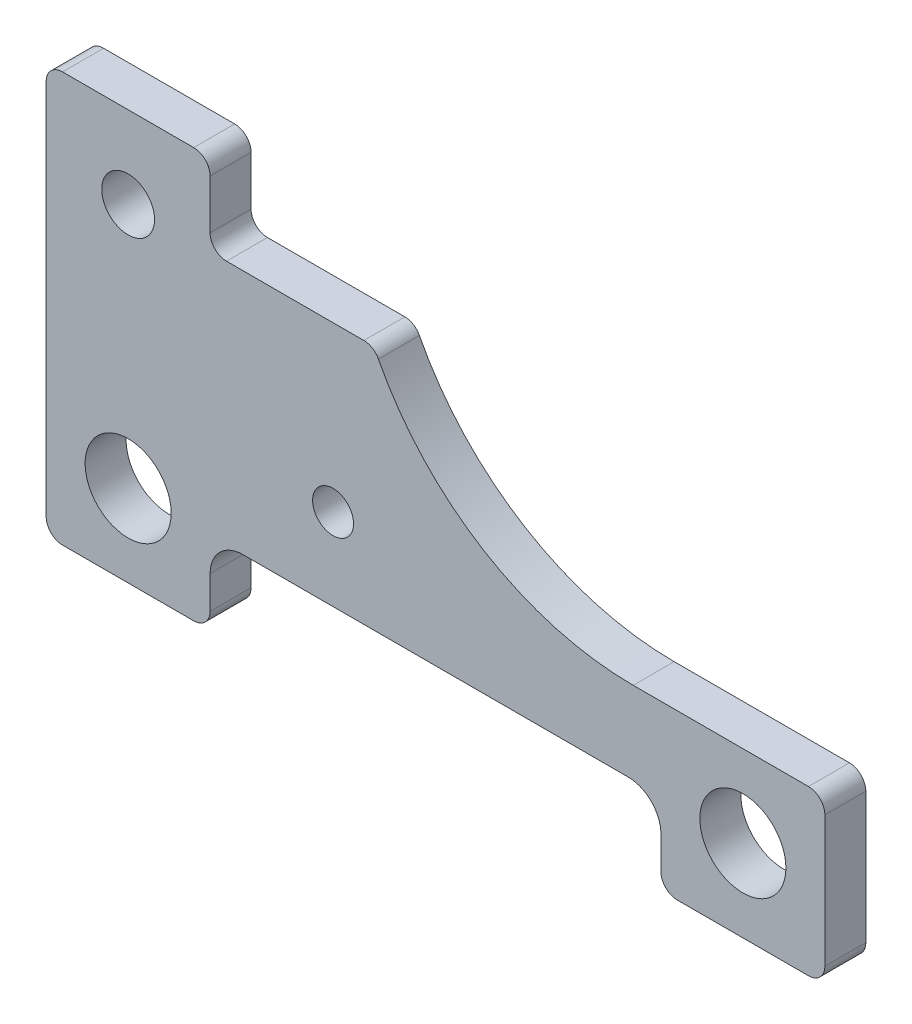
ISO-10303-21;
HEADER;
FILE_DESCRIPTION(('STEP AP214'),'2;1');
FILE_NAME('part.step','',(''),(''),'','','');
FILE_SCHEMA(('AUTOMOTIVE_DESIGN { 1 0 10303 214 1 1 1 1 }'));
ENDSEC;
DATA;
#1=APPLICATION_CONTEXT('core data for automotive mechanical design processes');
#2=APPLICATION_PROTOCOL_DEFINITION('international standard','automotive_design',2000,#1);
#3=PRODUCT_CONTEXT('',#1,'mechanical');
#4=PRODUCT('Part','Part','',(#3));
#5=PRODUCT_RELATED_PRODUCT_CATEGORY('part','',(#4));
#6=PRODUCT_DEFINITION_FORMATION('','',#4);
#7=PRODUCT_DEFINITION_CONTEXT('part definition',#1,'design');
#8=PRODUCT_DEFINITION('design','',#6,#7);
#9=PRODUCT_DEFINITION_SHAPE('','',#8);
#10=(LENGTH_UNIT() NAMED_UNIT(*) SI_UNIT(.MILLI.,.METRE.));
#11=(NAMED_UNIT(*) PLANE_ANGLE_UNIT() SI_UNIT($,.RADIAN.));
#12=(NAMED_UNIT(*) SI_UNIT($,.STERADIAN.) SOLID_ANGLE_UNIT());
#13=UNCERTAINTY_MEASURE_WITH_UNIT(LENGTH_MEASURE(1.E-05),#10,'distance_accuracy_value','');
#14=(GEOMETRIC_REPRESENTATION_CONTEXT(3) GLOBAL_UNCERTAINTY_ASSIGNED_CONTEXT((#13)) GLOBAL_UNIT_ASSIGNED_CONTEXT((#10,
#11,#12)) REPRESENTATION_CONTEXT('',''));
#15=CARTESIAN_POINT('',(0.,0.,0.));
#16=DIRECTION('',(0.,0.,1.));
#17=DIRECTION('',(1.,0.,0.));
#18=AXIS2_PLACEMENT_3D('',#15,#16,#17);
#19=CARTESIAN_POINT('',(24.1237229910367,54.9980046734949,2.5));
#20=DIRECTION('',(0.,0.,1.));
#21=DIRECTION('',(1.,0.,0.));
#22=AXIS2_PLACEMENT_3D('',#19,#20,#21);
#23=PLANE('',#22);
#24=CARTESIAN_POINT('',(37.5,9.9980046734949,2.5));
#25=DIRECTION('',(0.,0.,1.));
#26=DIRECTION('',(1.,0.,0.));
#27=AXIS2_PLACEMENT_3D('',#24,#25,#26);
#28=CIRCLE('',#27,5.25);
#29=CARTESIAN_POINT('',(42.75,9.9980046734949,2.5));
#30=VERTEX_POINT('',#29);
#31=EDGE_CURVE('E786',#30,#30,#28,.T.);
#32=ORIENTED_EDGE('',*,*,#31,.F.);
#33=EDGE_LOOP('',(#32));
#34=FACE_BOUND('',#33,.T.);
#35=CARTESIAN_POINT('',(-37.5,40.,2.5));
#36=DIRECTION('',(0.,0.,1.));
#37=DIRECTION('',(1.,0.,0.));
#38=AXIS2_PLACEMENT_3D('',#35,#36,#37);
#39=CIRCLE('',#38,3.225);
#40=CARTESIAN_POINT('',(-34.275,40.,2.5));
#41=VERTEX_POINT('',#40);
#42=EDGE_CURVE('E247',#41,#41,#39,.T.);
#43=ORIENTED_EDGE('',*,*,#42,.F.);
#44=EDGE_LOOP('',(#43));
#45=FACE_BOUND('',#44,.T.);
#46=CARTESIAN_POINT('',(24.1237229910367,54.9980046734949,2.5));
#47=DIRECTION('',(0.,0.,-1.));
#48=DIRECTION('',(1.,0.,0.));
#49=AXIS2_PLACEMENT_3D('',#46,#47,#48);
#50=CIRCLE('',#49,35.);
#51=CARTESIAN_POINT('',(24.1237229910367,19.9980046734949,2.5));
#52=VERTEX_POINT('',#51);
#53=CARTESIAN_POINT('',(-6.96420927938158,38.9188110634321,2.5));
#54=VERTEX_POINT('',#53);
#55=EDGE_CURVE('E199',#52,#54,#50,.T.);
#56=ORIENTED_EDGE('',*,*,#55,.T.);
#57=CARTESIAN_POINT('',(-8.74066255197692,38.,2.5));
#58=DIRECTION('',(0.,0.,1.));
#59=DIRECTION('',(1.,0.,0.));
#60=AXIS2_PLACEMENT_3D('',#57,#58,#59);
#61=CIRCLE('',#60,2.);
#62=CARTESIAN_POINT('',(-8.74066255197692,40.,2.5));
#63=VERTEX_POINT('',#62);
#64=EDGE_CURVE('E366',#54,#63,#61,.T.);
#65=ORIENTED_EDGE('',*,*,#64,.T.);
#66=DIRECTION('',(-1.,0.,0.));
#67=VECTOR('',#66,1.);
#68=CARTESIAN_POINT('',(-27.5,40.,2.5));
#69=LINE('',#68,#67);
#70=CARTESIAN_POINT('',(-25.5,40.,2.5));
#71=VERTEX_POINT('',#70);
#72=EDGE_CURVE('E226',#63,#71,#69,.T.);
#73=ORIENTED_EDGE('',*,*,#72,.T.);
#74=CARTESIAN_POINT('',(-25.5,42.,2.5));
#75=DIRECTION('',(0.,0.,1.));
#76=DIRECTION('',(1.,0.,0.));
#77=AXIS2_PLACEMENT_3D('',#74,#75,#76);
#78=CIRCLE('',#77,2.);
#79=CARTESIAN_POINT('',(-27.5,42.,2.5));
#80=VERTEX_POINT('',#79);
#81=EDGE_CURVE('E11',#71,#80,#78,.F.);
#82=ORIENTED_EDGE('',*,*,#81,.T.);
#83=DIRECTION('',(0.,1.,0.));
#84=VECTOR('',#83,1.);
#85=CARTESIAN_POINT('',(-27.5,50.,2.5));
#86=LINE('',#85,#84);
#87=CARTESIAN_POINT('',(-27.5,48.,2.5));
#88=VERTEX_POINT('',#87);
#89=EDGE_CURVE('E230',#80,#88,#86,.T.);
#90=ORIENTED_EDGE('',*,*,#89,.T.);
#91=CARTESIAN_POINT('',(-29.5,48.,2.5));
#92=DIRECTION('',(0.,0.,1.));
#93=DIRECTION('',(1.,0.,0.));
#94=AXIS2_PLACEMENT_3D('',#91,#92,#93);
#95=CIRCLE('',#94,2.);
#96=CARTESIAN_POINT('',(-29.5,50.,2.5));
#97=VERTEX_POINT('',#96);
#98=EDGE_CURVE('E355',#88,#97,#95,.T.);
#99=ORIENTED_EDGE('',*,*,#98,.T.);
#100=DIRECTION('',(-1.,0.,0.));
#101=VECTOR('',#100,1.);
#102=CARTESIAN_POINT('',(-47.5,50.,2.5));
#103=LINE('',#102,#101);
#104=CARTESIAN_POINT('',(-45.5,50.,2.5));
#105=VERTEX_POINT('',#104);
#106=EDGE_CURVE('E237',#97,#105,#103,.T.);
#107=ORIENTED_EDGE('',*,*,#106,.T.);
#108=CARTESIAN_POINT('',(-45.5,48.,2.5));
#109=DIRECTION('',(0.,0.,1.));
#110=DIRECTION('',(1.,0.,0.));
#111=AXIS2_PLACEMENT_3D('',#108,#109,#110);
#112=CIRCLE('',#111,2.);
#113=CARTESIAN_POINT('',(-47.5,48.,2.5));
#114=VERTEX_POINT('',#113);
#115=EDGE_CURVE('E62',#105,#114,#112,.T.);
#116=ORIENTED_EDGE('',*,*,#115,.T.);
#117=DIRECTION('',(0.,-1.,0.));
#118=VECTOR('',#117,1.);
#119=CARTESIAN_POINT('',(-47.5,0.,2.5));
#120=LINE('',#119,#118);
#121=CARTESIAN_POINT('',(-47.5,1.99999999999999,2.5));
#122=VERTEX_POINT('',#121);
#123=EDGE_CURVE('E220',#114,#122,#120,.T.);
#124=ORIENTED_EDGE('',*,*,#123,.T.);
#125=CARTESIAN_POINT('',(-45.5,1.99999999999999,2.5));
#126=DIRECTION('',(0.,0.,1.));
#127=DIRECTION('',(1.,0.,0.));
#128=AXIS2_PLACEMENT_3D('',#125,#126,#127);
#129=CIRCLE('',#128,2.);
#130=CARTESIAN_POINT('',(-45.5,0.,2.5));
#131=VERTEX_POINT('',#130);
#132=EDGE_CURVE('E347',#122,#131,#129,.T.);
#133=ORIENTED_EDGE('',*,*,#132,.T.);
#134=DIRECTION('',(1.,0.,0.));
#135=VECTOR('',#134,1.);
#136=CARTESIAN_POINT('',(-47.5,0.,2.5));
#137=LINE('',#136,#135);
#138=CARTESIAN_POINT('',(-29.5,0.,2.5));
#139=VERTEX_POINT('',#138);
#140=EDGE_CURVE('E285',#131,#139,#137,.T.);
#141=ORIENTED_EDGE('',*,*,#140,.T.);
#142=CARTESIAN_POINT('',(-29.5,2.,2.5));
#143=DIRECTION('',(0.,0.,1.));
#144=DIRECTION('',(1.,0.,0.));
#145=AXIS2_PLACEMENT_3D('',#142,#143,#144);
#146=CIRCLE('',#145,2.);
#147=CARTESIAN_POINT('',(-27.5,2.,2.5));
#148=VERTEX_POINT('',#147);
#149=EDGE_CURVE('E350',#139,#148,#146,.T.);
#150=ORIENTED_EDGE('',*,*,#149,.T.);
#151=DIRECTION('',(0.,1.,0.));
#152=VECTOR('',#151,1.);
#153=CARTESIAN_POINT('',(-27.5,0.,2.5));
#154=LINE('',#153,#152);
#155=CARTESIAN_POINT('',(-27.5,6.,2.5));
#156=VERTEX_POINT('',#155);
#157=EDGE_CURVE('E463',#148,#156,#154,.T.);
#158=ORIENTED_EDGE('',*,*,#157,.T.);
#159=CARTESIAN_POINT('',(-23.5,6.,2.5));
#160=DIRECTION('',(0.,0.,1.));
#161=DIRECTION('',(1.,0.,0.));
#162=AXIS2_PLACEMENT_3D('',#159,#160,#161);
#163=CIRCLE('',#162,4.);
#164=CARTESIAN_POINT('',(-23.5,10.,2.5));
#165=VERTEX_POINT('',#164);
#166=EDGE_CURVE('E311',#156,#165,#163,.F.);
#167=ORIENTED_EDGE('',*,*,#166,.T.);
#168=DIRECTION('',(1.,0.,0.));
#169=VECTOR('',#168,1.);
#170=CARTESIAN_POINT('',(-27.5,10.,2.5));
#171=LINE('',#170,#169);
#172=CARTESIAN_POINT('',(23.5,10.,2.5));
#173=VERTEX_POINT('',#172);
#174=EDGE_CURVE('E466',#165,#173,#171,.T.);
#175=ORIENTED_EDGE('',*,*,#174,.T.);
#176=CARTESIAN_POINT('',(23.5,6.,2.5));
#177=DIRECTION('',(0.,0.,1.));
#178=DIRECTION('',(1.,0.,0.));
#179=AXIS2_PLACEMENT_3D('',#176,#177,#178);
#180=CIRCLE('',#179,4.);
#181=CARTESIAN_POINT('',(27.5,6.,2.5));
#182=VERTEX_POINT('',#181);
#183=EDGE_CURVE('E304',#173,#182,#180,.F.);
#184=ORIENTED_EDGE('',*,*,#183,.T.);
#185=DIRECTION('',(0.,-1.,0.));
#186=VECTOR('',#185,1.);
#187=CARTESIAN_POINT('',(27.5,10.,2.5));
#188=LINE('',#187,#186);
#189=CARTESIAN_POINT('',(27.5,1.9980046734949,2.5));
#190=VERTEX_POINT('',#189);
#191=EDGE_CURVE('E475',#182,#190,#188,.T.);
#192=ORIENTED_EDGE('',*,*,#191,.T.);
#193=CARTESIAN_POINT('',(29.5,1.9980046734949,2.5));
#194=DIRECTION('',(0.,0.,1.));
#195=DIRECTION('',(1.,0.,0.));
#196=AXIS2_PLACEMENT_3D('',#193,#194,#195);
#197=CIRCLE('',#196,2.);
#198=CARTESIAN_POINT('',(29.5,-0.0019953265051019,2.5));
#199=VERTEX_POINT('',#198);
#200=EDGE_CURVE('E363',#190,#199,#197,.T.);
#201=ORIENTED_EDGE('',*,*,#200,.T.);
#202=DIRECTION('',(1.,0.,0.));
#203=VECTOR('',#202,1.);
#204=CARTESIAN_POINT('',(27.5,-0.0019953265051019,2.5));
#205=LINE('',#204,#203);
#206=CARTESIAN_POINT('',(45.5,-0.0019953265051019,2.5));
#207=VERTEX_POINT('',#206);
#208=EDGE_CURVE('E479',#199,#207,#205,.T.);
#209=ORIENTED_EDGE('',*,*,#208,.T.);
#210=CARTESIAN_POINT('',(45.5,1.9980046734949,2.5));
#211=DIRECTION('',(0.,0.,1.));
#212=DIRECTION('',(1.,0.,0.));
#213=AXIS2_PLACEMENT_3D('',#210,#211,#212);
#214=CIRCLE('',#213,2.);
#215=CARTESIAN_POINT('',(47.5,1.9980046734949,2.5));
#216=VERTEX_POINT('',#215);
#217=EDGE_CURVE('E360',#207,#216,#214,.T.);
#218=ORIENTED_EDGE('',*,*,#217,.T.);
#219=DIRECTION('',(0.,1.,0.));
#220=VECTOR('',#219,1.);
#221=CARTESIAN_POINT('',(47.5,-0.0019953265051019,2.5));
#222=LINE('',#221,#220);
#223=CARTESIAN_POINT('',(47.5,17.9980046734949,2.5));
#224=VERTEX_POINT('',#223);
#225=EDGE_CURVE('E208',#216,#224,#222,.T.);
#226=ORIENTED_EDGE('',*,*,#225,.T.);
#227=CARTESIAN_POINT('',(45.5,17.9980046734949,2.5));
#228=DIRECTION('',(0.,0.,1.));
#229=DIRECTION('',(1.,0.,0.));
#230=AXIS2_PLACEMENT_3D('',#227,#228,#229);
#231=CIRCLE('',#230,2.);
#232=CARTESIAN_POINT('',(45.5,19.9980046734949,2.5));
#233=VERTEX_POINT('',#232);
#234=EDGE_CURVE('E203',#224,#233,#231,.T.);
#235=ORIENTED_EDGE('',*,*,#234,.T.);
#236=DIRECTION('',(-1.,0.,0.));
#237=VECTOR('',#236,1.);
#238=CARTESIAN_POINT('',(47.5,19.9980046734949,2.5));
#239=LINE('',#238,#237);
#240=EDGE_CURVE('E195',#233,#52,#239,.T.);
#241=ORIENTED_EDGE('',*,*,#240,.T.);
#242=EDGE_LOOP('',(#56,#65,#73,#82,#90,#99,#107,#116,#124,#133,#141,#150,#158,#167,#175,#184,
#192,#201,#209,#218,#226,#235,#241));
#243=FACE_BOUND('',#242,.T.);
#244=CARTESIAN_POINT('',(-37.5,10.,2.5));
#245=DIRECTION('',(0.,0.,1.));
#246=DIRECTION('',(1.,0.,0.));
#247=AXIS2_PLACEMENT_3D('',#244,#245,#246);
#248=CIRCLE('',#247,5.25);
#249=CARTESIAN_POINT('',(-32.25,10.,2.5));
#250=VERTEX_POINT('',#249);
#251=EDGE_CURVE('E777',#250,#250,#248,.T.);
#252=ORIENTED_EDGE('',*,*,#251,.F.);
#253=EDGE_LOOP('',(#252));
#254=FACE_BOUND('',#253,.T.);
#255=CARTESIAN_POINT('',(-12.5,20.,2.5));
#256=DIRECTION('',(0.,0.,1.));
#257=DIRECTION('',(1.,0.,0.));
#258=AXIS2_PLACEMENT_3D('',#255,#256,#257);
#259=CIRCLE('',#258,2.5);
#260=CARTESIAN_POINT('',(-10.,20.,2.5));
#261=VERTEX_POINT('',#260);
#262=EDGE_CURVE('E793',#261,#261,#259,.T.);
#263=ORIENTED_EDGE('',*,*,#262,.F.);
#264=EDGE_LOOP('',(#263));
#265=FACE_BOUND('',#264,.T.);
#266=ADVANCED_FACE('F39',(#34,#45,#243,#254,#265),#23,.T.);
#267=CARTESIAN_POINT('',(24.1237229910367,54.9980046734949,-2.5));
#268=DIRECTION('',(0.,0.,1.));
#269=DIRECTION('',(1.,0.,0.));
#270=AXIS2_PLACEMENT_3D('',#267,#268,#269);
#271=PLANE('',#270);
#272=DIRECTION('',(-1.,0.,0.));
#273=VECTOR('',#272,1.);
#274=CARTESIAN_POINT('',(-27.5,40.,-2.5));
#275=LINE('',#274,#273);
#276=CARTESIAN_POINT('',(-8.74066255197692,40.,-2.5));
#277=VERTEX_POINT('',#276);
#278=CARTESIAN_POINT('',(-25.5,40.,-2.5));
#279=VERTEX_POINT('',#278);
#280=EDGE_CURVE('E271',#277,#279,#275,.T.);
#281=ORIENTED_EDGE('',*,*,#280,.F.);
#282=CARTESIAN_POINT('',(-8.74066255197692,38.,-2.5));
#283=DIRECTION('',(0.,0.,1.));
#284=DIRECTION('',(1.,0.,0.));
#285=AXIS2_PLACEMENT_3D('',#282,#283,#284);
#286=CIRCLE('',#285,2.);
#287=CARTESIAN_POINT('',(-6.96420927938158,38.9188110634321,-2.5));
#288=VERTEX_POINT('',#287);
#289=EDGE_CURVE('E342',#277,#288,#286,.F.);
#290=ORIENTED_EDGE('',*,*,#289,.T.);
#291=CARTESIAN_POINT('',(24.1237229910367,54.9980046734949,-2.5));
#292=DIRECTION('',(0.,0.,-1.));
#293=DIRECTION('',(1.,0.,0.));
#294=AXIS2_PLACEMENT_3D('',#291,#292,#293);
#295=CIRCLE('',#294,35.);
#296=CARTESIAN_POINT('',(24.1237229910367,19.9980046734949,-2.5));
#297=VERTEX_POINT('',#296);
#298=EDGE_CURVE('E268',#297,#288,#295,.T.);
#299=ORIENTED_EDGE('',*,*,#298,.F.);
#300=DIRECTION('',(-1.,0.,0.));
#301=VECTOR('',#300,1.);
#302=CARTESIAN_POINT('',(47.5,19.9980046734949,-2.5));
#303=LINE('',#302,#301);
#304=CARTESIAN_POINT('',(45.5,19.9980046734949,-2.5));
#305=VERTEX_POINT('',#304);
#306=EDGE_CURVE('E214',#305,#297,#303,.T.);
#307=ORIENTED_EDGE('',*,*,#306,.F.);
#308=CARTESIAN_POINT('',(45.5,17.9980046734949,-2.5));
#309=DIRECTION('',(0.,0.,1.));
#310=DIRECTION('',(1.,0.,0.));
#311=AXIS2_PLACEMENT_3D('',#308,#309,#310);
#312=CIRCLE('',#311,2.);
#313=CARTESIAN_POINT('',(47.5,17.9980046734949,-2.5));
#314=VERTEX_POINT('',#313);
#315=EDGE_CURVE('E333',#305,#314,#312,.F.);
#316=ORIENTED_EDGE('',*,*,#315,.T.);
#317=DIRECTION('',(0.,1.,0.));
#318=VECTOR('',#317,1.);
#319=CARTESIAN_POINT('',(47.5,-0.0019953265051019,-2.5));
#320=LINE('',#319,#318);
#321=CARTESIAN_POINT('',(47.5,1.9980046734949,-2.5));
#322=VERTEX_POINT('',#321);
#323=EDGE_CURVE('E262',#322,#314,#320,.T.);
#324=ORIENTED_EDGE('',*,*,#323,.F.);
#325=CARTESIAN_POINT('',(45.5,1.9980046734949,-2.5));
#326=DIRECTION('',(0.,0.,1.));
#327=DIRECTION('',(1.,0.,0.));
#328=AXIS2_PLACEMENT_3D('',#325,#326,#327);
#329=CIRCLE('',#328,2.);
#330=CARTESIAN_POINT('',(45.5,-0.0019953265051019,-2.5));
#331=VERTEX_POINT('',#330);
#332=EDGE_CURVE('E336',#322,#331,#329,.F.);
#333=ORIENTED_EDGE('',*,*,#332,.T.);
#334=DIRECTION('',(1.,0.,0.));
#335=VECTOR('',#334,1.);
#336=CARTESIAN_POINT('',(27.5,-0.0019953265051019,-2.5));
#337=LINE('',#336,#335);
#338=CARTESIAN_POINT('',(29.5,-0.0019953265051019,-2.5));
#339=VERTEX_POINT('',#338);
#340=EDGE_CURVE('E258',#339,#331,#337,.T.);
#341=ORIENTED_EDGE('',*,*,#340,.F.);
#342=CARTESIAN_POINT('',(29.5,1.9980046734949,-2.5));
#343=DIRECTION('',(0.,0.,1.));
#344=DIRECTION('',(1.,0.,0.));
#345=AXIS2_PLACEMENT_3D('',#342,#343,#344);
#346=CIRCLE('',#345,2.);
#347=CARTESIAN_POINT('',(27.5,1.9980046734949,-2.5));
#348=VERTEX_POINT('',#347);
#349=EDGE_CURVE('E339',#339,#348,#346,.F.);
#350=ORIENTED_EDGE('',*,*,#349,.T.);
#351=DIRECTION('',(0.,-1.,0.));
#352=VECTOR('',#351,1.);
#353=CARTESIAN_POINT('',(27.5,10.,-2.5));
#354=LINE('',#353,#352);
#355=CARTESIAN_POINT('',(27.5,6.,-2.5));
#356=VERTEX_POINT('',#355);
#357=EDGE_CURVE('E254',#356,#348,#354,.T.);
#358=ORIENTED_EDGE('',*,*,#357,.F.);
#359=CARTESIAN_POINT('',(23.5,6.,-2.5));
#360=DIRECTION('',(0.,0.,1.));
#361=DIRECTION('',(1.,0.,0.));
#362=AXIS2_PLACEMENT_3D('',#359,#360,#361);
#363=CIRCLE('',#362,4.);
#364=CARTESIAN_POINT('',(23.5,10.,-2.5));
#365=VERTEX_POINT('',#364);
#366=EDGE_CURVE('E301',#356,#365,#363,.T.);
#367=ORIENTED_EDGE('',*,*,#366,.T.);
#368=DIRECTION('',(1.,0.,0.));
#369=VECTOR('',#368,1.);
#370=CARTESIAN_POINT('',(-27.5,10.,-2.5));
#371=LINE('',#370,#369);
#372=CARTESIAN_POINT('',(-23.5,10.,-2.5));
#373=VERTEX_POINT('',#372);
#374=EDGE_CURVE('E250',#373,#365,#371,.T.);
#375=ORIENTED_EDGE('',*,*,#374,.F.);
#376=CARTESIAN_POINT('',(-23.5,6.,-2.5));
#377=DIRECTION('',(0.,0.,1.));
#378=DIRECTION('',(1.,0.,0.));
#379=AXIS2_PLACEMENT_3D('',#376,#377,#378);
#380=CIRCLE('',#379,4.);
#381=CARTESIAN_POINT('',(-27.5,6.,-2.5));
#382=VERTEX_POINT('',#381);
#383=EDGE_CURVE('E307',#373,#382,#380,.T.);
#384=ORIENTED_EDGE('',*,*,#383,.T.);
#385=DIRECTION('',(0.,1.,0.));
#386=VECTOR('',#385,1.);
#387=CARTESIAN_POINT('',(-27.5,0.,-2.5));
#388=LINE('',#387,#386);
#389=CARTESIAN_POINT('',(-27.5,2.,-2.5));
#390=VERTEX_POINT('',#389);
#391=EDGE_CURVE('E246',#390,#382,#388,.T.);
#392=ORIENTED_EDGE('',*,*,#391,.F.);
#393=CARTESIAN_POINT('',(-29.5,2.,-2.5));
#394=DIRECTION('',(0.,0.,1.));
#395=DIRECTION('',(1.,0.,0.));
#396=AXIS2_PLACEMENT_3D('',#393,#394,#395);
#397=CIRCLE('',#396,2.);
#398=CARTESIAN_POINT('',(-29.5,0.,-2.5));
#399=VERTEX_POINT('',#398);
#400=EDGE_CURVE('E324',#390,#399,#397,.F.);
#401=ORIENTED_EDGE('',*,*,#400,.T.);
#402=DIRECTION('',(1.,0.,0.));
#403=VECTOR('',#402,1.);
#404=CARTESIAN_POINT('',(-47.5,0.,-2.5));
#405=LINE('',#404,#403);
#406=CARTESIAN_POINT('',(-45.5,0.,-2.5));
#407=VERTEX_POINT('',#406);
#408=EDGE_CURVE('E242',#407,#399,#405,.T.);
#409=ORIENTED_EDGE('',*,*,#408,.F.);
#410=CARTESIAN_POINT('',(-45.5,1.99999999999999,-2.5));
#411=DIRECTION('',(0.,0.,1.));
#412=DIRECTION('',(1.,0.,0.));
#413=AXIS2_PLACEMENT_3D('',#410,#411,#412);
#414=CIRCLE('',#413,2.);
#415=CARTESIAN_POINT('',(-47.5,1.99999999999999,-2.5));
#416=VERTEX_POINT('',#415);
#417=EDGE_CURVE('E321',#407,#416,#414,.F.);
#418=ORIENTED_EDGE('',*,*,#417,.T.);
#419=DIRECTION('',(0.,-1.,0.));
#420=VECTOR('',#419,1.);
#421=CARTESIAN_POINT('',(-47.5,0.,-2.5));
#422=LINE('',#421,#420);
#423=CARTESIAN_POINT('',(-47.5,48.,-2.5));
#424=VERTEX_POINT('',#423);
#425=EDGE_CURVE('E283',#424,#416,#422,.T.);
#426=ORIENTED_EDGE('',*,*,#425,.F.);
#427=CARTESIAN_POINT('',(-45.5,48.,-2.5));
#428=DIRECTION('',(0.,0.,1.));
#429=DIRECTION('',(1.,0.,0.));
#430=AXIS2_PLACEMENT_3D('',#427,#428,#429);
#431=CIRCLE('',#430,2.);
#432=CARTESIAN_POINT('',(-45.5,50.,-2.5));
#433=VERTEX_POINT('',#432);
#434=EDGE_CURVE('E327',#424,#433,#431,.F.);
#435=ORIENTED_EDGE('',*,*,#434,.T.);
#436=DIRECTION('',(-1.,0.,0.));
#437=VECTOR('',#436,1.);
#438=CARTESIAN_POINT('',(-47.5,50.,-2.5));
#439=LINE('',#438,#437);
#440=CARTESIAN_POINT('',(-29.5,50.,-2.5));
#441=VERTEX_POINT('',#440);
#442=EDGE_CURVE('E279',#441,#433,#439,.T.);
#443=ORIENTED_EDGE('',*,*,#442,.F.);
#444=CARTESIAN_POINT('',(-29.5,48.,-2.5));
#445=DIRECTION('',(0.,0.,1.));
#446=DIRECTION('',(1.,0.,0.));
#447=AXIS2_PLACEMENT_3D('',#444,#445,#446);
#448=CIRCLE('',#447,2.);
#449=CARTESIAN_POINT('',(-27.5,48.,-2.5));
#450=VERTEX_POINT('',#449);
#451=EDGE_CURVE('E330',#441,#450,#448,.F.);
#452=ORIENTED_EDGE('',*,*,#451,.T.);
#453=DIRECTION('',(0.,1.,0.));
#454=VECTOR('',#453,1.);
#455=CARTESIAN_POINT('',(-27.5,50.,-2.5));
#456=LINE('',#455,#454);
#457=CARTESIAN_POINT('',(-27.5,42.,-2.5));
#458=VERTEX_POINT('',#457);
#459=EDGE_CURVE('E275',#458,#450,#456,.T.);
#460=ORIENTED_EDGE('',*,*,#459,.F.);
#461=CARTESIAN_POINT('',(-25.5,42.,-2.5));
#462=DIRECTION('',(0.,0.,1.));
#463=DIRECTION('',(1.,0.,0.));
#464=AXIS2_PLACEMENT_3D('',#461,#462,#463);
#465=CIRCLE('',#464,2.);
#466=EDGE_CURVE('E48',#458,#279,#465,.T.);
#467=ORIENTED_EDGE('',*,*,#466,.T.);
#468=EDGE_LOOP('',(#281,#290,#299,#307,#316,#324,#333,#341,#350,#358,#367,#375,#384,#392,#401,
#409,#418,#426,#435,#443,#452,#460,#467));
#469=FACE_BOUND('',#468,.T.);
#470=CARTESIAN_POINT('',(-37.5,40.,-2.5));
#471=DIRECTION('',(0.,0.,1.));
#472=DIRECTION('',(1.,0.,0.));
#473=AXIS2_PLACEMENT_3D('',#470,#471,#472);
#474=CIRCLE('',#473,3.225);
#475=CARTESIAN_POINT('',(-34.275,40.,-2.5));
#476=VERTEX_POINT('',#475);
#477=EDGE_CURVE('E469',#476,#476,#474,.T.);
#478=ORIENTED_EDGE('',*,*,#477,.T.);
#479=EDGE_LOOP('',(#478));
#480=FACE_BOUND('',#479,.T.);
#481=CARTESIAN_POINT('',(-37.5,10.,-2.5));
#482=DIRECTION('',(0.,0.,1.));
#483=DIRECTION('',(1.,0.,0.));
#484=AXIS2_PLACEMENT_3D('',#481,#482,#483);
#485=CIRCLE('',#484,5.25);
#486=CARTESIAN_POINT('',(-32.25,10.,-2.5));
#487=VERTEX_POINT('',#486);
#488=EDGE_CURVE('E781',#487,#487,#485,.T.);
#489=ORIENTED_EDGE('',*,*,#488,.T.);
#490=EDGE_LOOP('',(#489));
#491=FACE_BOUND('',#490,.T.);
#492=CARTESIAN_POINT('',(37.5,9.9980046734949,-2.5));
#493=DIRECTION('',(0.,0.,1.));
#494=DIRECTION('',(1.,0.,0.));
#495=AXIS2_PLACEMENT_3D('',#492,#493,#494);
#496=CIRCLE('',#495,5.25);
#497=CARTESIAN_POINT('',(42.75,9.9980046734949,-2.5));
#498=VERTEX_POINT('',#497);
#499=EDGE_CURVE('E789',#498,#498,#496,.T.);
#500=ORIENTED_EDGE('',*,*,#499,.T.);
#501=EDGE_LOOP('',(#500));
#502=FACE_BOUND('',#501,.T.);
#503=CARTESIAN_POINT('',(-12.5,20.,-2.5));
#504=DIRECTION('',(0.,0.,1.));
#505=DIRECTION('',(1.,0.,0.));
#506=AXIS2_PLACEMENT_3D('',#503,#504,#505);
#507=CIRCLE('',#506,2.5);
#508=CARTESIAN_POINT('',(-10.,20.,-2.5));
#509=VERTEX_POINT('',#508);
#510=EDGE_CURVE('E797',#509,#509,#507,.T.);
#511=ORIENTED_EDGE('',*,*,#510,.T.);
#512=EDGE_LOOP('',(#511));
#513=FACE_BOUND('',#512,.T.);
#514=ADVANCED_FACE('F423',(#469,#480,#491,#502,#513),#271,.F.);
#515=CARTESIAN_POINT('',(-47.5,0.,2.5));
#516=DIRECTION('',(0.,1.,0.));
#517=DIRECTION('',(-1.,0.,0.));
#518=AXIS2_PLACEMENT_3D('',#515,#516,#517);
#519=PLANE('',#518);
#520=ORIENTED_EDGE('',*,*,#408,.T.);
#521=DIRECTION('',(0.,0.,-1.));
#522=VECTOR('',#521,1.);
#523=CARTESIAN_POINT('',(-29.5,0.,2.5));
#524=LINE('',#523,#522);
#525=EDGE_CURVE('E417',#399,#139,#524,.F.);
#526=ORIENTED_EDGE('',*,*,#525,.T.);
#527=ORIENTED_EDGE('',*,*,#140,.F.);
#528=DIRECTION('',(0.,0.,-1.));
#529=VECTOR('',#528,1.);
#530=CARTESIAN_POINT('',(-45.5,0.,2.5));
#531=LINE('',#530,#529);
#532=EDGE_CURVE('E413',#131,#407,#531,.T.);
#533=ORIENTED_EDGE('',*,*,#532,.T.);
#534=EDGE_LOOP('',(#520,#526,#527,#533));
#535=FACE_BOUND('',#534,.T.);
#536=ADVANCED_FACE('F458',(#535),#519,.F.);
#537=CARTESIAN_POINT('',(-27.5,0.,2.5));
#538=DIRECTION('',(-1.,0.,0.));
#539=DIRECTION('',(0.,0.,1.));
#540=AXIS2_PLACEMENT_3D('',#537,#538,#539);
#541=PLANE('',#540);
#542=ORIENTED_EDGE('',*,*,#157,.F.);
#543=DIRECTION('',(0.,0.,-1.));
#544=VECTOR('',#543,1.);
#545=CARTESIAN_POINT('',(-27.5,2.,2.5));
#546=LINE('',#545,#544);
#547=EDGE_CURVE('E409',#148,#390,#546,.T.);
#548=ORIENTED_EDGE('',*,*,#547,.T.);
#549=ORIENTED_EDGE('',*,*,#391,.T.);
#550=DIRECTION('',(0.,0.,-1.));
#551=VECTOR('',#550,1.);
#552=CARTESIAN_POINT('',(-27.5,6.,2.5));
#553=LINE('',#552,#551);
#554=EDGE_CURVE('E297',#382,#156,#553,.F.);
#555=ORIENTED_EDGE('',*,*,#554,.T.);
#556=EDGE_LOOP('',(#542,#548,#549,#555));
#557=FACE_BOUND('',#556,.T.);
#558=ADVANCED_FACE('F546',(#557),#541,.F.);
#559=CARTESIAN_POINT('',(-27.5,10.,2.5));
#560=DIRECTION('',(0.,1.,0.));
#561=DIRECTION('',(0.,0.,1.));
#562=AXIS2_PLACEMENT_3D('',#559,#560,#561);
#563=PLANE('',#562);
#564=ORIENTED_EDGE('',*,*,#374,.T.);
#565=DIRECTION('',(0.,0.,-1.));
#566=VECTOR('',#565,1.);
#567=CARTESIAN_POINT('',(23.5,10.,2.5));
#568=LINE('',#567,#566);
#569=EDGE_CURVE('E294',#365,#173,#568,.F.);
#570=ORIENTED_EDGE('',*,*,#569,.T.);
#571=ORIENTED_EDGE('',*,*,#174,.F.);
#572=DIRECTION('',(0.,0.,-1.));
#573=VECTOR('',#572,1.);
#574=CARTESIAN_POINT('',(-23.5,10.,-2.5));
#575=LINE('',#574,#573);
#576=EDGE_CURVE('E290',#165,#373,#575,.T.);
#577=ORIENTED_EDGE('',*,*,#576,.T.);
#578=EDGE_LOOP('',(#564,#570,#571,#577));
#579=FACE_BOUND('',#578,.T.);
#580=ADVANCED_FACE('F542',(#579),#563,.F.);
#581=CARTESIAN_POINT('',(27.5,10.,2.5));
#582=DIRECTION('',(1.,0.,0.));
#583=DIRECTION('',(0.,0.,-1.));
#584=AXIS2_PLACEMENT_3D('',#581,#582,#583);
#585=PLANE('',#584);
#586=ORIENTED_EDGE('',*,*,#357,.T.);
#587=DIRECTION('',(0.,0.,-1.));
#588=VECTOR('',#587,1.);
#589=CARTESIAN_POINT('',(27.5,1.9980046734949,2.5));
#590=LINE('',#589,#588);
#591=EDGE_CURVE('E376',#348,#190,#590,.F.);
#592=ORIENTED_EDGE('',*,*,#591,.T.);
#593=ORIENTED_EDGE('',*,*,#191,.F.);
#594=DIRECTION('',(0.,0.,-1.));
#595=VECTOR('',#594,1.);
#596=CARTESIAN_POINT('',(27.5,6.,-2.5));
#597=LINE('',#596,#595);
#598=EDGE_CURVE('E219',#182,#356,#597,.T.);
#599=ORIENTED_EDGE('',*,*,#598,.T.);
#600=EDGE_LOOP('',(#586,#592,#593,#599));
#601=FACE_BOUND('',#600,.T.);
#602=ADVANCED_FACE('F538',(#601),#585,.F.);
#603=CARTESIAN_POINT('',(27.5,-0.0019953265051019,2.5));
#604=DIRECTION('',(0.,1.,0.));
#605=DIRECTION('',(0.,0.,1.));
#606=AXIS2_PLACEMENT_3D('',#603,#604,#605);
#607=PLANE('',#606);
#608=ORIENTED_EDGE('',*,*,#208,.F.);
#609=DIRECTION('',(0.,0.,-1.));
#610=VECTOR('',#609,1.);
#611=CARTESIAN_POINT('',(29.5,-0.0019953265051019,2.5));
#612=LINE('',#611,#610);
#613=EDGE_CURVE('E372',#199,#339,#612,.T.);
#614=ORIENTED_EDGE('',*,*,#613,.T.);
#615=ORIENTED_EDGE('',*,*,#340,.T.);
#616=DIRECTION('',(0.,0.,-1.));
#617=VECTOR('',#616,1.);
#618=CARTESIAN_POINT('',(45.5,-0.0019953265051019,2.5));
#619=LINE('',#618,#617);
#620=EDGE_CURVE('E369',#331,#207,#619,.F.);
#621=ORIENTED_EDGE('',*,*,#620,.T.);
#622=EDGE_LOOP('',(#608,#614,#615,#621));
#623=FACE_BOUND('',#622,.T.);
#624=ADVANCED_FACE('F535',(#623),#607,.F.);
#625=CARTESIAN_POINT('',(47.5,-0.0019953265051019,2.5));
#626=DIRECTION('',(-1.,0.,0.));
#627=DIRECTION('',(0.,0.,1.));
#628=AXIS2_PLACEMENT_3D('',#625,#626,#627);
#629=PLANE('',#628);
#630=ORIENTED_EDGE('',*,*,#225,.F.);
#631=DIRECTION('',(0.,0.,-1.));
#632=VECTOR('',#631,1.);
#633=CARTESIAN_POINT('',(47.5,1.9980046734949,2.5));
#634=LINE('',#633,#632);
#635=EDGE_CURVE('E382',#216,#322,#634,.T.);
#636=ORIENTED_EDGE('',*,*,#635,.T.);
#637=ORIENTED_EDGE('',*,*,#323,.T.);
#638=DIRECTION('',(0.,0.,-1.));
#639=VECTOR('',#638,1.);
#640=CARTESIAN_POINT('',(47.5,17.9980046734949,2.5));
#641=LINE('',#640,#639);
#642=EDGE_CURVE('E379',#314,#224,#641,.F.);
#643=ORIENTED_EDGE('',*,*,#642,.T.);
#644=EDGE_LOOP('',(#630,#636,#637,#643));
#645=FACE_BOUND('',#644,.T.);
#646=ADVANCED_FACE('F532',(#645),#629,.F.);
#647=CARTESIAN_POINT('',(47.5,19.9980046734949,2.5));
#648=DIRECTION('',(0.,-1.,0.));
#649=DIRECTION('',(1.,0.,0.));
#650=AXIS2_PLACEMENT_3D('',#647,#648,#649);
#651=PLANE('',#650);
#652=ORIENTED_EDGE('',*,*,#240,.F.);
#653=DIRECTION('',(0.,0.,-1.));
#654=VECTOR('',#653,1.);
#655=CARTESIAN_POINT('',(45.5,19.9980046734949,2.5));
#656=LINE('',#655,#654);
#657=EDGE_CURVE('E386',#233,#305,#656,.T.);
#658=ORIENTED_EDGE('',*,*,#657,.T.);
#659=ORIENTED_EDGE('',*,*,#306,.T.);
#660=DIRECTION('',(0.,0.,-1.));
#661=VECTOR('',#660,1.);
#662=CARTESIAN_POINT('',(24.1237229910367,19.9980046734949,2.5));
#663=LINE('',#662,#661);
#664=EDGE_CURVE('E211',#52,#297,#663,.T.);
#665=ORIENTED_EDGE('',*,*,#664,.F.);
#666=EDGE_LOOP('',(#652,#658,#659,#665));
#667=FACE_BOUND('',#666,.T.);
#668=ADVANCED_FACE('F212',(#667),#651,.F.);
#669=CARTESIAN_POINT('',(24.1237229910367,54.9980046734949,2.5));
#670=DIRECTION('',(0.,0.,-1.));
#671=DIRECTION('',(-1.,0.,0.));
#672=AXIS2_PLACEMENT_3D('',#669,#670,#671);
#673=CYLINDRICAL_SURFACE('',#672,35.);
#674=ORIENTED_EDGE('',*,*,#298,.T.);
#675=DIRECTION('',(0.,0.,-1.));
#676=VECTOR('',#675,1.);
#677=CARTESIAN_POINT('',(-6.96420927938158,38.9188110634321,2.5));
#678=LINE('',#677,#676);
#679=EDGE_CURVE('E224',#288,#54,#678,.F.);
#680=ORIENTED_EDGE('',*,*,#679,.T.);
#681=ORIENTED_EDGE('',*,*,#55,.F.);
#682=ORIENTED_EDGE('',*,*,#664,.T.);
#683=EDGE_LOOP('',(#674,#680,#681,#682));
#684=FACE_BOUND('',#683,.T.);
#685=ADVANCED_FACE('F222',(#684),#673,.F.);
#686=CARTESIAN_POINT('',(-27.5,40.,2.5));
#687=DIRECTION('',(0.,-1.,0.));
#688=DIRECTION('',(0.,0.,-1.));
#689=AXIS2_PLACEMENT_3D('',#686,#687,#688);
#690=PLANE('',#689);
#691=ORIENTED_EDGE('',*,*,#72,.F.);
#692=DIRECTION('',(0.,0.,-1.));
#693=VECTOR('',#692,1.);
#694=CARTESIAN_POINT('',(-8.74066255197692,40.,2.5));
#695=LINE('',#694,#693);
#696=EDGE_CURVE('E317',#63,#277,#695,.T.);
#697=ORIENTED_EDGE('',*,*,#696,.T.);
#698=ORIENTED_EDGE('',*,*,#280,.T.);
#699=DIRECTION('',(0.,0.,-1.));
#700=VECTOR('',#699,1.);
#701=CARTESIAN_POINT('',(-25.5,40.,2.5));
#702=LINE('',#701,#700);
#703=EDGE_CURVE('E314',#279,#71,#702,.F.);
#704=ORIENTED_EDGE('',*,*,#703,.T.);
#705=EDGE_LOOP('',(#691,#697,#698,#704));
#706=FACE_BOUND('',#705,.T.);
#707=ADVANCED_FACE('F430',(#706),#690,.F.);
#708=CARTESIAN_POINT('',(-27.5,50.,2.5));
#709=DIRECTION('',(-1.,0.,0.));
#710=DIRECTION('',(0.,-1.,0.));
#711=AXIS2_PLACEMENT_3D('',#708,#709,#710);
#712=PLANE('',#711);
#713=ORIENTED_EDGE('',*,*,#89,.F.);
#714=DIRECTION('',(0.,0.,-1.));
#715=VECTOR('',#714,1.);
#716=CARTESIAN_POINT('',(-27.5,42.,-2.5));
#717=LINE('',#716,#715);
#718=EDGE_CURVE('E392',#80,#458,#717,.T.);
#719=ORIENTED_EDGE('',*,*,#718,.T.);
#720=ORIENTED_EDGE('',*,*,#459,.T.);
#721=DIRECTION('',(0.,0.,-1.));
#722=VECTOR('',#721,1.);
#723=CARTESIAN_POINT('',(-27.5,48.,2.5));
#724=LINE('',#723,#722);
#725=EDGE_CURVE('E389',#450,#88,#724,.F.);
#726=ORIENTED_EDGE('',*,*,#725,.T.);
#727=EDGE_LOOP('',(#713,#719,#720,#726));
#728=FACE_BOUND('',#727,.T.);
#729=ADVANCED_FACE('F437',(#728),#712,.F.);
#730=CARTESIAN_POINT('',(-47.5,50.,2.5));
#731=DIRECTION('',(0.,-1.,0.));
#732=DIRECTION('',(0.,0.,-1.));
#733=AXIS2_PLACEMENT_3D('',#730,#731,#732);
#734=PLANE('',#733);
#735=ORIENTED_EDGE('',*,*,#106,.F.);
#736=DIRECTION('',(0.,0.,-1.));
#737=VECTOR('',#736,1.);
#738=CARTESIAN_POINT('',(-29.5,50.,2.5));
#739=LINE('',#738,#737);
#740=EDGE_CURVE('E399',#97,#441,#739,.T.);
#741=ORIENTED_EDGE('',*,*,#740,.T.);
#742=ORIENTED_EDGE('',*,*,#442,.T.);
#743=DIRECTION('',(0.,0.,-1.));
#744=VECTOR('',#743,1.);
#745=CARTESIAN_POINT('',(-45.5,50.,2.5));
#746=LINE('',#745,#744);
#747=EDGE_CURVE('E396',#433,#105,#746,.F.);
#748=ORIENTED_EDGE('',*,*,#747,.T.);
#749=EDGE_LOOP('',(#735,#741,#742,#748));
#750=FACE_BOUND('',#749,.T.);
#751=ADVANCED_FACE('F444',(#750),#734,.F.);
#752=CARTESIAN_POINT('',(-47.5,0.,2.5));
#753=DIRECTION('',(1.,0.,0.));
#754=DIRECTION('',(0.,0.,-1.));
#755=AXIS2_PLACEMENT_3D('',#752,#753,#754);
#756=PLANE('',#755);
#757=ORIENTED_EDGE('',*,*,#123,.F.);
#758=DIRECTION('',(0.,0.,-1.));
#759=VECTOR('',#758,1.);
#760=CARTESIAN_POINT('',(-47.5,48.,2.5));
#761=LINE('',#760,#759);
#762=EDGE_CURVE('E405',#114,#424,#761,.T.);
#763=ORIENTED_EDGE('',*,*,#762,.T.);
#764=ORIENTED_EDGE('',*,*,#425,.T.);
#765=DIRECTION('',(0.,0.,-1.));
#766=VECTOR('',#765,1.);
#767=CARTESIAN_POINT('',(-47.5,1.99999999999999,2.5));
#768=LINE('',#767,#766);
#769=EDGE_CURVE('E55',#416,#122,#768,.F.);
#770=ORIENTED_EDGE('',*,*,#769,.T.);
#771=EDGE_LOOP('',(#757,#763,#764,#770));
#772=FACE_BOUND('',#771,.T.);
#773=ADVANCED_FACE('F451',(#772),#756,.F.);
#774=CARTESIAN_POINT('',(-37.5,40.,2.5));
#775=DIRECTION('',(0.,0.,-1.));
#776=DIRECTION('',(-1.,0.,0.));
#777=AXIS2_PLACEMENT_3D('',#774,#775,#776);
#778=CYLINDRICAL_SURFACE('',#777,3.225);
#779=ORIENTED_EDGE('',*,*,#42,.T.);
#780=EDGE_LOOP('',(#779));
#781=FACE_BOUND('',#780,.T.);
#782=ORIENTED_EDGE('',*,*,#477,.F.);
#783=EDGE_LOOP('',(#782));
#784=FACE_BOUND('',#783,.T.);
#785=ADVANCED_FACE('F517',(#781,#784),#778,.F.);
#786=CARTESIAN_POINT('',(-37.5,10.,2.5));
#787=DIRECTION('',(0.,0.,-1.));
#788=DIRECTION('',(-1.,0.,0.));
#789=AXIS2_PLACEMENT_3D('',#786,#787,#788);
#790=CYLINDRICAL_SURFACE('',#789,5.25);
#791=ORIENTED_EDGE('',*,*,#251,.T.);
#792=EDGE_LOOP('',(#791));
#793=FACE_BOUND('',#792,.T.);
#794=ORIENTED_EDGE('',*,*,#488,.F.);
#795=EDGE_LOOP('',(#794));
#796=FACE_BOUND('',#795,.T.);
#797=ADVANCED_FACE('F670',(#793,#796),#790,.F.);
#798=CARTESIAN_POINT('',(37.5,9.9980046734949,2.5));
#799=DIRECTION('',(0.,0.,-1.));
#800=DIRECTION('',(-1.,0.,0.));
#801=AXIS2_PLACEMENT_3D('',#798,#799,#800);
#802=CYLINDRICAL_SURFACE('',#801,5.25);
#803=ORIENTED_EDGE('',*,*,#31,.T.);
#804=EDGE_LOOP('',(#803));
#805=FACE_BOUND('',#804,.T.);
#806=ORIENTED_EDGE('',*,*,#499,.F.);
#807=EDGE_LOOP('',(#806));
#808=FACE_BOUND('',#807,.T.);
#809=ADVANCED_FACE('F559',(#805,#808),#802,.F.);
#810=CARTESIAN_POINT('',(-12.5,20.,2.5));
#811=DIRECTION('',(0.,0.,-1.));
#812=DIRECTION('',(-1.,0.,0.));
#813=AXIS2_PLACEMENT_3D('',#810,#811,#812);
#814=CYLINDRICAL_SURFACE('',#813,2.5);
#815=ORIENTED_EDGE('',*,*,#262,.T.);
#816=EDGE_LOOP('',(#815));
#817=FACE_BOUND('',#816,.T.);
#818=ORIENTED_EDGE('',*,*,#510,.F.);
#819=EDGE_LOOP('',(#818));
#820=FACE_BOUND('',#819,.T.);
#821=ADVANCED_FACE('F554',(#817,#820),#814,.F.);
#822=CARTESIAN_POINT('',(23.5,6.,2.5));
#823=DIRECTION('',(0.,0.,1.));
#824=DIRECTION('',(1.,0.,0.));
#825=AXIS2_PLACEMENT_3D('',#822,#823,#824);
#826=CYLINDRICAL_SURFACE('',#825,4.);
#827=ORIENTED_EDGE('',*,*,#183,.F.);
#828=ORIENTED_EDGE('',*,*,#569,.F.);
#829=ORIENTED_EDGE('',*,*,#366,.F.);
#830=ORIENTED_EDGE('',*,*,#598,.F.);
#831=EDGE_LOOP('',(#827,#828,#829,#830));
#832=FACE_BOUND('',#831,.T.);
#833=ADVANCED_FACE('F504',(#832),#826,.F.);
#834=CARTESIAN_POINT('',(-23.5,6.,2.5));
#835=DIRECTION('',(0.,0.,1.));
#836=DIRECTION('',(1.,0.,0.));
#837=AXIS2_PLACEMENT_3D('',#834,#835,#836);
#838=CYLINDRICAL_SURFACE('',#837,4.);
#839=ORIENTED_EDGE('',*,*,#166,.F.);
#840=ORIENTED_EDGE('',*,*,#554,.F.);
#841=ORIENTED_EDGE('',*,*,#383,.F.);
#842=ORIENTED_EDGE('',*,*,#576,.F.);
#843=EDGE_LOOP('',(#839,#840,#841,#842));
#844=FACE_BOUND('',#843,.T.);
#845=ADVANCED_FACE('F495',(#844),#838,.F.);
#846=CARTESIAN_POINT('',(-8.74066255197692,38.,2.5));
#847=DIRECTION('',(0.,0.,-1.));
#848=DIRECTION('',(-1.,0.,0.));
#849=AXIS2_PLACEMENT_3D('',#846,#847,#848);
#850=CYLINDRICAL_SURFACE('',#849,2.);
#851=ORIENTED_EDGE('',*,*,#64,.F.);
#852=ORIENTED_EDGE('',*,*,#679,.F.);
#853=ORIENTED_EDGE('',*,*,#289,.F.);
#854=ORIENTED_EDGE('',*,*,#696,.F.);
#855=EDGE_LOOP('',(#851,#852,#853,#854));
#856=FACE_BOUND('',#855,.T.);
#857=ADVANCED_FACE('F492',(#856),#850,.T.);
#858=CARTESIAN_POINT('',(29.5,1.9980046734949,2.5));
#859=DIRECTION('',(0.,0.,-1.));
#860=DIRECTION('',(-1.,0.,0.));
#861=AXIS2_PLACEMENT_3D('',#858,#859,#860);
#862=CYLINDRICAL_SURFACE('',#861,2.);
#863=ORIENTED_EDGE('',*,*,#200,.F.);
#864=ORIENTED_EDGE('',*,*,#591,.F.);
#865=ORIENTED_EDGE('',*,*,#349,.F.);
#866=ORIENTED_EDGE('',*,*,#613,.F.);
#867=EDGE_LOOP('',(#863,#864,#865,#866));
#868=FACE_BOUND('',#867,.T.);
#869=ADVANCED_FACE('F494',(#868),#862,.T.);
#870=CARTESIAN_POINT('',(45.5,1.9980046734949,2.5));
#871=DIRECTION('',(0.,0.,-1.));
#872=DIRECTION('',(-1.,0.,0.));
#873=AXIS2_PLACEMENT_3D('',#870,#871,#872);
#874=CYLINDRICAL_SURFACE('',#873,2.);
#875=ORIENTED_EDGE('',*,*,#217,.F.);
#876=ORIENTED_EDGE('',*,*,#620,.F.);
#877=ORIENTED_EDGE('',*,*,#332,.F.);
#878=ORIENTED_EDGE('',*,*,#635,.F.);
#879=EDGE_LOOP('',(#875,#876,#877,#878));
#880=FACE_BOUND('',#879,.T.);
#881=ADVANCED_FACE('F501',(#880),#874,.T.);
#882=CARTESIAN_POINT('',(45.5,17.9980046734949,2.5));
#883=DIRECTION('',(0.,0.,-1.));
#884=DIRECTION('',(-1.,0.,0.));
#885=AXIS2_PLACEMENT_3D('',#882,#883,#884);
#886=CYLINDRICAL_SURFACE('',#885,2.);
#887=ORIENTED_EDGE('',*,*,#234,.F.);
#888=ORIENTED_EDGE('',*,*,#642,.F.);
#889=ORIENTED_EDGE('',*,*,#315,.F.);
#890=ORIENTED_EDGE('',*,*,#657,.F.);
#891=EDGE_LOOP('',(#887,#888,#889,#890));
#892=FACE_BOUND('',#891,.T.);
#893=ADVANCED_FACE('F489',(#892),#886,.T.);
#894=CARTESIAN_POINT('',(-25.5,42.,2.5));
#895=DIRECTION('',(0.,0.,1.));
#896=DIRECTION('',(1.,0.,0.));
#897=AXIS2_PLACEMENT_3D('',#894,#895,#896);
#898=CYLINDRICAL_SURFACE('',#897,2.);
#899=ORIENTED_EDGE('',*,*,#81,.F.);
#900=ORIENTED_EDGE('',*,*,#703,.F.);
#901=ORIENTED_EDGE('',*,*,#466,.F.);
#902=ORIENTED_EDGE('',*,*,#718,.F.);
#903=EDGE_LOOP('',(#899,#900,#901,#902));
#904=FACE_BOUND('',#903,.T.);
#905=ADVANCED_FACE('F433',(#904),#898,.F.);
#906=CARTESIAN_POINT('',(-29.5,48.,2.5));
#907=DIRECTION('',(0.,0.,-1.));
#908=DIRECTION('',(-1.,0.,0.));
#909=AXIS2_PLACEMENT_3D('',#906,#907,#908);
#910=CYLINDRICAL_SURFACE('',#909,2.);
#911=ORIENTED_EDGE('',*,*,#98,.F.);
#912=ORIENTED_EDGE('',*,*,#725,.F.);
#913=ORIENTED_EDGE('',*,*,#451,.F.);
#914=ORIENTED_EDGE('',*,*,#740,.F.);
#915=EDGE_LOOP('',(#911,#912,#913,#914));
#916=FACE_BOUND('',#915,.T.);
#917=ADVANCED_FACE('F440',(#916),#910,.T.);
#918=CARTESIAN_POINT('',(-45.5,48.,2.5));
#919=DIRECTION('',(0.,0.,-1.));
#920=DIRECTION('',(-1.,0.,0.));
#921=AXIS2_PLACEMENT_3D('',#918,#919,#920);
#922=CYLINDRICAL_SURFACE('',#921,2.);
#923=ORIENTED_EDGE('',*,*,#115,.F.);
#924=ORIENTED_EDGE('',*,*,#747,.F.);
#925=ORIENTED_EDGE('',*,*,#434,.F.);
#926=ORIENTED_EDGE('',*,*,#762,.F.);
#927=EDGE_LOOP('',(#923,#924,#925,#926));
#928=FACE_BOUND('',#927,.T.);
#929=ADVANCED_FACE('F448',(#928),#922,.T.);
#930=CARTESIAN_POINT('',(-29.5,2.,2.5));
#931=DIRECTION('',(0.,0.,-1.));
#932=DIRECTION('',(-1.,0.,0.));
#933=AXIS2_PLACEMENT_3D('',#930,#931,#932);
#934=CYLINDRICAL_SURFACE('',#933,2.);
#935=ORIENTED_EDGE('',*,*,#149,.F.);
#936=ORIENTED_EDGE('',*,*,#525,.F.);
#937=ORIENTED_EDGE('',*,*,#400,.F.);
#938=ORIENTED_EDGE('',*,*,#547,.F.);
#939=EDGE_LOOP('',(#935,#936,#937,#938));
#940=FACE_BOUND('',#939,.T.);
#941=ADVANCED_FACE('F583',(#940),#934,.T.);
#942=CARTESIAN_POINT('',(-45.5,1.99999999999999,2.5));
#943=DIRECTION('',(0.,0.,-1.));
#944=DIRECTION('',(-1.,0.,0.));
#945=AXIS2_PLACEMENT_3D('',#942,#943,#944);
#946=CYLINDRICAL_SURFACE('',#945,2.);
#947=ORIENTED_EDGE('',*,*,#132,.F.);
#948=ORIENTED_EDGE('',*,*,#769,.F.);
#949=ORIENTED_EDGE('',*,*,#417,.F.);
#950=ORIENTED_EDGE('',*,*,#532,.F.);
#951=EDGE_LOOP('',(#947,#948,#949,#950));
#952=FACE_BOUND('',#951,.T.);
#953=ADVANCED_FACE('F41',(#952),#946,.T.);
#954=CLOSED_SHELL('',(#266,#514,#536,#558,#580,#602,#624,#646,#668,#685,#707,#729,#751,#773,
#785,#797,#809,#821,#833,#845,#857,#869,#881,#893,#905,#917,#929,#941,#953));
#955=MANIFOLD_SOLID_BREP('B2',#954);
#956=ADVANCED_BREP_SHAPE_REPRESENTATION('',(#18,#955),#14);
#957=SHAPE_DEFINITION_REPRESENTATION(#9,#956);
ENDSEC;
END-ISO-10303-21;
